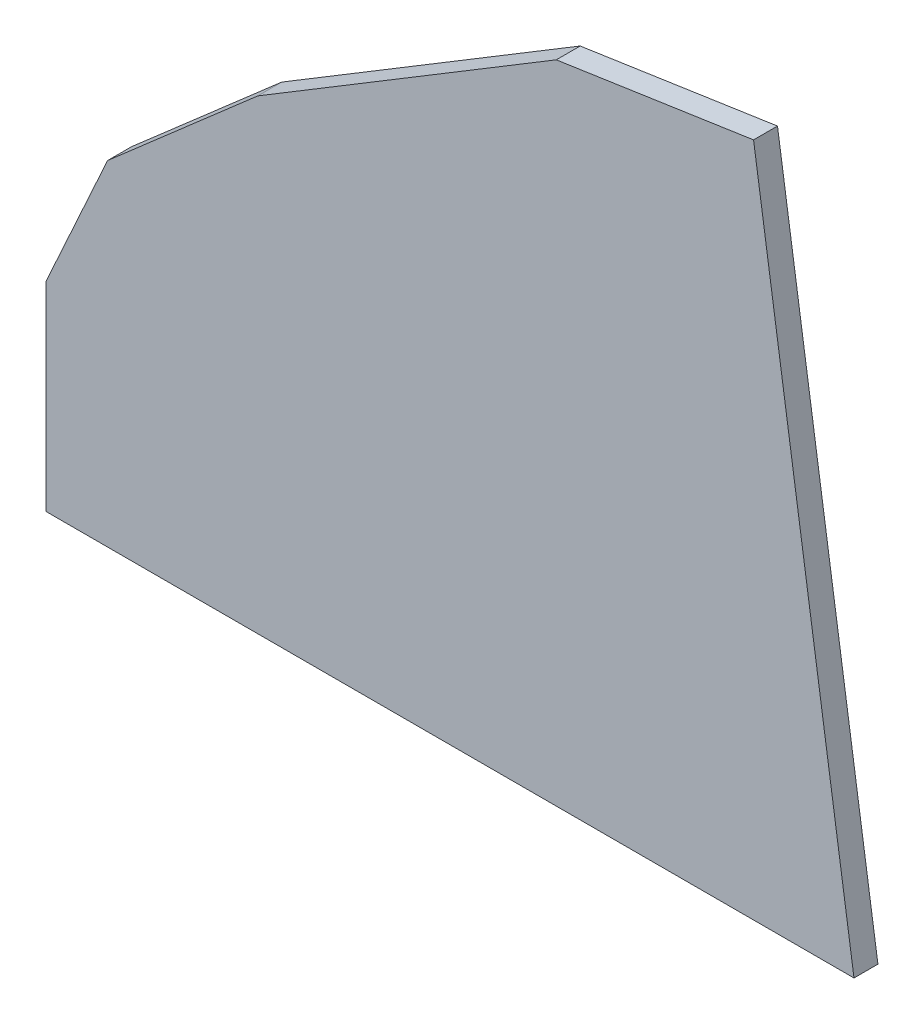
ISO-10303-21;
HEADER;
FILE_DESCRIPTION(('STEP AP214'),'2;1');
FILE_NAME('part.step','',(''),(''),'','','');
FILE_SCHEMA(('AUTOMOTIVE_DESIGN { 1 0 10303 214 1 1 1 1 }'));
ENDSEC;
DATA;
#1=APPLICATION_CONTEXT('core data for automotive mechanical design processes');
#2=APPLICATION_PROTOCOL_DEFINITION('international standard','automotive_design',2000,#1);
#3=PRODUCT_CONTEXT('',#1,'mechanical');
#4=PRODUCT('Part','Part','',(#3));
#5=PRODUCT_RELATED_PRODUCT_CATEGORY('part','',(#4));
#6=PRODUCT_DEFINITION_FORMATION('','',#4);
#7=PRODUCT_DEFINITION_CONTEXT('part definition',#1,'design');
#8=PRODUCT_DEFINITION('design','',#6,#7);
#9=PRODUCT_DEFINITION_SHAPE('','',#8);
#10=(LENGTH_UNIT() NAMED_UNIT(*) SI_UNIT(.MILLI.,.METRE.));
#11=(NAMED_UNIT(*) PLANE_ANGLE_UNIT() SI_UNIT($,.RADIAN.));
#12=(NAMED_UNIT(*) SI_UNIT($,.STERADIAN.) SOLID_ANGLE_UNIT());
#13=UNCERTAINTY_MEASURE_WITH_UNIT(LENGTH_MEASURE(1.E-05),#10,'distance_accuracy_value','');
#14=(GEOMETRIC_REPRESENTATION_CONTEXT(3) GLOBAL_UNCERTAINTY_ASSIGNED_CONTEXT((#13)) GLOBAL_UNIT_ASSIGNED_CONTEXT((#10,
#11,#12)) REPRESENTATION_CONTEXT('',''));
#15=CARTESIAN_POINT('',(0.,0.,0.));
#16=DIRECTION('',(0.,0.,1.));
#17=DIRECTION('',(1.,0.,0.));
#18=AXIS2_PLACEMENT_3D('',#15,#16,#17);
#19=CARTESIAN_POINT('',(-132.613596935672,212.007275279474,-6.));
#20=DIRECTION('',(-0.517407565698856,0.855739102155314,0.));
#21=DIRECTION('',(-0.855739102155315,-0.517407565698856,0.));
#22=AXIS2_PLACEMENT_3D('',#19,#20,#21);
#23=PLANE('',#22);
#24=DIRECTION('',(-0.855739102155315,-0.517407565698856,0.));
#25=VECTOR('',#24,1.);
#26=CARTESIAN_POINT('',(-132.613596935672,212.007275279474,0.));
#27=LINE('',#26,#25);
#28=CARTESIAN_POINT('',(-132.613596935672,212.007275279474,0.));
#29=VERTEX_POINT('',#28);
#30=CARTESIAN_POINT('',(-207.414598297112,166.780168175474,0.));
#31=VERTEX_POINT('',#30);
#32=EDGE_CURVE('E127',#29,#31,#27,.T.);
#33=ORIENTED_EDGE('',*,*,#32,.F.);
#34=DIRECTION('',(0.,0.,1.));
#35=VECTOR('',#34,1.);
#36=CARTESIAN_POINT('',(-132.613596935672,212.007275279474,-6.));
#37=LINE('',#36,#35);
#38=CARTESIAN_POINT('',(-132.613596935672,212.007275279474,-6.));
#39=VERTEX_POINT('',#38);
#40=EDGE_CURVE('E11',#39,#29,#37,.T.);
#41=ORIENTED_EDGE('',*,*,#40,.F.);
#42=DIRECTION('',(-0.855739102155315,-0.517407565698856,0.));
#43=VECTOR('',#42,1.);
#44=CARTESIAN_POINT('',(-132.613596935672,212.007275279474,-6.));
#45=LINE('',#44,#43);
#46=CARTESIAN_POINT('',(-207.414598297112,166.780168175474,-6.));
#47=VERTEX_POINT('',#46);
#48=EDGE_CURVE('E144',#39,#47,#45,.T.);
#49=ORIENTED_EDGE('',*,*,#48,.T.);
#50=DIRECTION('',(0.,0.,1.));
#51=VECTOR('',#50,1.);
#52=CARTESIAN_POINT('',(-207.414598297112,166.780168175474,-6.));
#53=LINE('',#52,#51);
#54=EDGE_CURVE('E39',#47,#31,#53,.T.);
#55=ORIENTED_EDGE('',*,*,#54,.T.);
#56=EDGE_LOOP('',(#33,#41,#49,#55));
#57=FACE_BOUND('',#56,.T.);
#58=ADVANCED_FACE('F36',(#57),#23,.T.);
#59=CARTESIAN_POINT('',(-83.1570250117381,219.358975323192,-6.));
#60=DIRECTION('',(-0.147034000874357,0.989131438478668,0.));
#61=DIRECTION('',(-0.989131438478668,-0.147034000874357,0.));
#62=AXIS2_PLACEMENT_3D('',#59,#60,#61);
#63=PLANE('',#62);
#64=DIRECTION('',(-0.989131438478668,-0.147034000874357,0.));
#65=VECTOR('',#64,1.);
#66=CARTESIAN_POINT('',(-83.1570250117381,219.358975323192,0.));
#67=LINE('',#66,#65);
#68=CARTESIAN_POINT('',(-83.1570250117381,219.358975323192,0.));
#69=VERTEX_POINT('',#68);
#70=EDGE_CURVE('E142',#69,#29,#67,.T.);
#71=ORIENTED_EDGE('',*,*,#70,.F.);
#72=DIRECTION('',(0.,0.,1.));
#73=VECTOR('',#72,1.);
#74=CARTESIAN_POINT('',(-83.1570250117381,219.358975323192,-6.));
#75=LINE('',#74,#73);
#76=CARTESIAN_POINT('',(-83.1570250117381,219.358975323192,-6.));
#77=VERTEX_POINT('',#76);
#78=EDGE_CURVE('E45',#77,#69,#75,.T.);
#79=ORIENTED_EDGE('',*,*,#78,.F.);
#80=DIRECTION('',(-0.989131438478668,-0.147034000874357,0.));
#81=VECTOR('',#80,1.);
#82=CARTESIAN_POINT('',(-83.1570250117381,219.358975323192,-6.));
#83=LINE('',#82,#81);
#84=EDGE_CURVE('E117',#77,#39,#83,.T.);
#85=ORIENTED_EDGE('',*,*,#84,.T.);
#86=ORIENTED_EDGE('',*,*,#40,.T.);
#87=EDGE_LOOP('',(#71,#79,#85,#86));
#88=FACE_BOUND('',#87,.T.);
#89=ADVANCED_FACE('F154',(#88),#63,.T.);
#90=CARTESIAN_POINT('',(-57.981879670033,49.9999999999999,-6.));
#91=DIRECTION('',(0.989131438478668,0.147034000874357,0.));
#92=DIRECTION('',(-0.147034000874357,0.989131438478668,0.));
#93=AXIS2_PLACEMENT_3D('',#90,#91,#92);
#94=PLANE('',#93);
#95=DIRECTION('',(-0.147034000874357,0.989131438478668,0.));
#96=VECTOR('',#95,1.);
#97=CARTESIAN_POINT('',(-57.981879670033,49.9999999999999,0.));
#98=LINE('',#97,#96);
#99=CARTESIAN_POINT('',(-57.981879670033,49.9999999999999,0.));
#100=VERTEX_POINT('',#99);
#101=EDGE_CURVE('E104',#100,#69,#98,.T.);
#102=ORIENTED_EDGE('',*,*,#101,.F.);
#103=DIRECTION('',(0.,0.,1.));
#104=VECTOR('',#103,1.);
#105=CARTESIAN_POINT('',(-57.981879670033,49.9999999999999,-6.));
#106=LINE('',#105,#104);
#107=CARTESIAN_POINT('',(-57.981879670033,49.9999999999999,-6.));
#108=VERTEX_POINT('',#107);
#109=EDGE_CURVE('E99',#108,#100,#106,.T.);
#110=ORIENTED_EDGE('',*,*,#109,.F.);
#111=DIRECTION('',(-0.147034000874357,0.989131438478668,0.));
#112=VECTOR('',#111,1.);
#113=CARTESIAN_POINT('',(-57.981879670033,49.9999999999999,-6.));
#114=LINE('',#113,#112);
#115=EDGE_CURVE('E102',#108,#77,#114,.T.);
#116=ORIENTED_EDGE('',*,*,#115,.T.);
#117=ORIENTED_EDGE('',*,*,#78,.T.);
#118=EDGE_LOOP('',(#102,#110,#116,#117));
#119=FACE_BOUND('',#118,.T.);
#120=ADVANCED_FACE('F101',(#119),#94,.T.);
#121=CARTESIAN_POINT('',(-260.502189932168,49.9999999999999,-6.));
#122=DIRECTION('',(0.,-1.,0.));
#123=DIRECTION('',(0.,0.,-1.));
#124=AXIS2_PLACEMENT_3D('',#121,#122,#123);
#125=PLANE('',#124);
#126=DIRECTION('',(1.,0.,0.));
#127=VECTOR('',#126,1.);
#128=CARTESIAN_POINT('',(-260.502189932168,49.9999999999999,0.));
#129=LINE('',#128,#127);
#130=CARTESIAN_POINT('',(-260.502189932168,49.9999999999999,0.));
#131=VERTEX_POINT('',#130);
#132=EDGE_CURVE('E139',#131,#100,#129,.T.);
#133=ORIENTED_EDGE('',*,*,#132,.F.);
#134=DIRECTION('',(0.,0.,1.));
#135=VECTOR('',#134,1.);
#136=CARTESIAN_POINT('',(-260.502189932168,49.9999999999999,-6.));
#137=LINE('',#136,#135);
#138=CARTESIAN_POINT('',(-260.502189932168,49.9999999999999,-6.));
#139=VERTEX_POINT('',#138);
#140=EDGE_CURVE('E109',#139,#131,#137,.T.);
#141=ORIENTED_EDGE('',*,*,#140,.F.);
#142=DIRECTION('',(1.,0.,0.));
#143=VECTOR('',#142,1.);
#144=CARTESIAN_POINT('',(-260.502189932168,49.9999999999999,-6.));
#145=LINE('',#144,#143);
#146=EDGE_CURVE('E115',#139,#108,#145,.T.);
#147=ORIENTED_EDGE('',*,*,#146,.T.);
#148=ORIENTED_EDGE('',*,*,#109,.T.);
#149=EDGE_LOOP('',(#133,#141,#147,#148));
#150=FACE_BOUND('',#149,.T.);
#151=ADVANCED_FACE('F119',(#150),#125,.T.);
#152=CARTESIAN_POINT('',(-260.502189932168,100.,-6.));
#153=DIRECTION('',(-1.,0.,0.));
#154=DIRECTION('',(0.,0.,1.));
#155=AXIS2_PLACEMENT_3D('',#152,#153,#154);
#156=PLANE('',#155);
#157=DIRECTION('',(0.,-1.,0.));
#158=VECTOR('',#157,1.);
#159=CARTESIAN_POINT('',(-260.502189932168,100.,0.));
#160=LINE('',#159,#158);
#161=CARTESIAN_POINT('',(-260.502189932168,100.,0.));
#162=VERTEX_POINT('',#161);
#163=EDGE_CURVE('E136',#162,#131,#160,.T.);
#164=ORIENTED_EDGE('',*,*,#163,.F.);
#165=DIRECTION('',(0.,0.,1.));
#166=VECTOR('',#165,1.);
#167=CARTESIAN_POINT('',(-260.502189932168,100.,-6.));
#168=LINE('',#167,#166);
#169=CARTESIAN_POINT('',(-260.502189932168,100.,-6.));
#170=VERTEX_POINT('',#169);
#171=EDGE_CURVE('E148',#170,#162,#168,.T.);
#172=ORIENTED_EDGE('',*,*,#171,.F.);
#173=DIRECTION('',(0.,-1.,0.));
#174=VECTOR('',#173,1.);
#175=CARTESIAN_POINT('',(-260.502189932168,100.,-6.));
#176=LINE('',#175,#174);
#177=EDGE_CURVE('E120',#170,#139,#176,.T.);
#178=ORIENTED_EDGE('',*,*,#177,.T.);
#179=ORIENTED_EDGE('',*,*,#140,.T.);
#180=EDGE_LOOP('',(#164,#172,#178,#179));
#181=FACE_BOUND('',#180,.T.);
#182=ADVANCED_FACE('F167',(#181),#156,.T.);
#183=CARTESIAN_POINT('',(-245.088489453456,133.906502040709,-6.));
#184=DIRECTION('',(-0.910349746716965,0.413839749966528,0.));
#185=DIRECTION('',(-0.413839749966528,-0.910349746716965,0.));
#186=AXIS2_PLACEMENT_3D('',#183,#184,#185);
#187=PLANE('',#186);
#188=DIRECTION('',(-0.413839749966528,-0.910349746716965,0.));
#189=VECTOR('',#188,1.);
#190=CARTESIAN_POINT('',(-245.088489453456,133.906502040709,0.));
#191=LINE('',#190,#189);
#192=CARTESIAN_POINT('',(-245.088489453456,133.906502040709,0.));
#193=VERTEX_POINT('',#192);
#194=EDGE_CURVE('E133',#193,#162,#191,.T.);
#195=ORIENTED_EDGE('',*,*,#194,.F.);
#196=DIRECTION('',(0.,0.,1.));
#197=VECTOR('',#196,1.);
#198=CARTESIAN_POINT('',(-245.088489453456,133.906502040709,-6.));
#199=LINE('',#198,#197);
#200=CARTESIAN_POINT('',(-245.088489453456,133.906502040709,-6.));
#201=VERTEX_POINT('',#200);
#202=EDGE_CURVE('E149',#201,#193,#199,.T.);
#203=ORIENTED_EDGE('',*,*,#202,.F.);
#204=DIRECTION('',(-0.413839749966528,-0.910349746716965,0.));
#205=VECTOR('',#204,1.);
#206=CARTESIAN_POINT('',(-245.088489453456,133.906502040709,-6.));
#207=LINE('',#206,#205);
#208=EDGE_CURVE('E122',#201,#170,#207,.T.);
#209=ORIENTED_EDGE('',*,*,#208,.T.);
#210=ORIENTED_EDGE('',*,*,#171,.T.);
#211=EDGE_LOOP('',(#195,#203,#209,#210));
#212=FACE_BOUND('',#211,.T.);
#213=ADVANCED_FACE('F170',(#212),#187,.T.);
#214=CARTESIAN_POINT('',(-207.414598297112,166.780168175474,-6.));
#215=DIRECTION('',(-0.657473322695291,0.753477823126874,0.));
#216=DIRECTION('',(-0.753477823126875,-0.657473322695291,0.));
#217=AXIS2_PLACEMENT_3D('',#214,#215,#216);
#218=PLANE('',#217);
#219=DIRECTION('',(-0.753477823126874,-0.657473322695291,0.));
#220=VECTOR('',#219,1.);
#221=CARTESIAN_POINT('',(-207.414598297112,166.780168175474,0.));
#222=LINE('',#221,#220);
#223=EDGE_CURVE('E130',#31,#193,#222,.T.);
#224=ORIENTED_EDGE('',*,*,#223,.F.);
#225=ORIENTED_EDGE('',*,*,#54,.F.);
#226=DIRECTION('',(-0.753477823126874,-0.657473322695291,0.));
#227=VECTOR('',#226,1.);
#228=CARTESIAN_POINT('',(-207.414598297112,166.780168175474,-6.));
#229=LINE('',#228,#227);
#230=EDGE_CURVE('E250',#47,#201,#229,.T.);
#231=ORIENTED_EDGE('',*,*,#230,.T.);
#232=ORIENTED_EDGE('',*,*,#202,.T.);
#233=EDGE_LOOP('',(#224,#225,#231,#232));
#234=FACE_BOUND('',#233,.T.);
#235=ADVANCED_FACE('F151',(#234),#218,.T.);
#236=CARTESIAN_POINT('',(0.,0.,-6.));
#237=DIRECTION('',(0.,0.,-1.));
#238=DIRECTION('',(-1.,0.,0.));
#239=AXIS2_PLACEMENT_3D('',#236,#237,#238);
#240=PLANE('',#239);
#241=ORIENTED_EDGE('',*,*,#48,.F.);
#242=ORIENTED_EDGE('',*,*,#84,.F.);
#243=ORIENTED_EDGE('',*,*,#115,.F.);
#244=ORIENTED_EDGE('',*,*,#146,.F.);
#245=ORIENTED_EDGE('',*,*,#177,.F.);
#246=ORIENTED_EDGE('',*,*,#208,.F.);
#247=ORIENTED_EDGE('',*,*,#230,.F.);
#248=EDGE_LOOP('',(#241,#242,#243,#244,#245,#246,#247));
#249=FACE_BOUND('',#248,.T.);
#250=ADVANCED_FACE('F113',(#249),#240,.T.);
#251=CARTESIAN_POINT('',(0.,0.,0.));
#252=DIRECTION('',(0.,0.,-1.));
#253=DIRECTION('',(-1.,0.,0.));
#254=AXIS2_PLACEMENT_3D('',#251,#252,#253);
#255=PLANE('',#254);
#256=ORIENTED_EDGE('',*,*,#32,.T.);
#257=ORIENTED_EDGE('',*,*,#223,.T.);
#258=ORIENTED_EDGE('',*,*,#194,.T.);
#259=ORIENTED_EDGE('',*,*,#163,.T.);
#260=ORIENTED_EDGE('',*,*,#132,.T.);
#261=ORIENTED_EDGE('',*,*,#101,.T.);
#262=ORIENTED_EDGE('',*,*,#70,.T.);
#263=EDGE_LOOP('',(#256,#257,#258,#259,#260,#261,#262));
#264=FACE_BOUND('',#263,.T.);
#265=ADVANCED_FACE('F153',(#264),#255,.F.);
#266=CLOSED_SHELL('',(#58,#89,#120,#151,#182,#213,#235,#250,#265));
#267=MANIFOLD_SOLID_BREP('B2',#266);
#268=ADVANCED_BREP_SHAPE_REPRESENTATION('',(#18,#267),#14);
#269=SHAPE_DEFINITION_REPRESENTATION(#9,#268);
ENDSEC;
END-ISO-10303-21;
